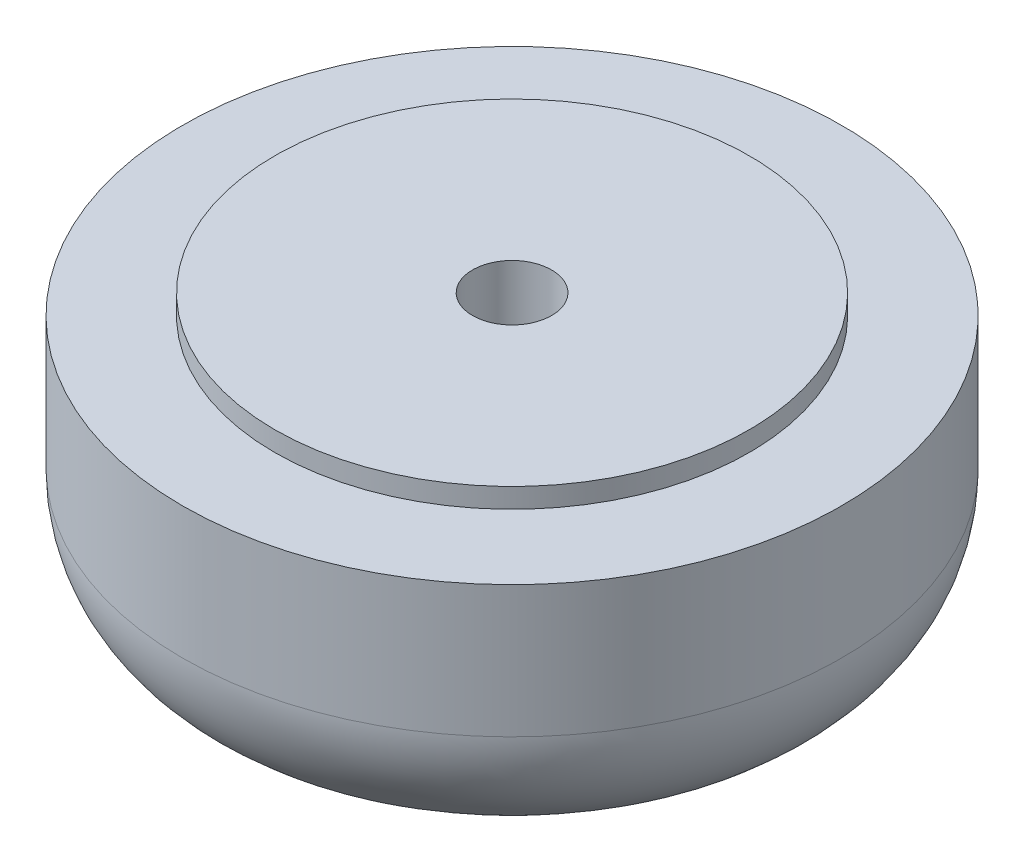
ISO-10303-21;
HEADER;
FILE_DESCRIPTION(('STEP AP214'),'2;1');
FILE_NAME('part.step','',(''),(''),'','','');
FILE_SCHEMA(('AUTOMOTIVE_DESIGN { 1 0 10303 214 1 1 1 1 }'));
ENDSEC;
DATA;
#1=APPLICATION_CONTEXT('core data for automotive mechanical design processes');
#2=APPLICATION_PROTOCOL_DEFINITION('international standard','automotive_design',2000,#1);
#3=PRODUCT_CONTEXT('',#1,'mechanical');
#4=PRODUCT('Part','Part','',(#3));
#5=PRODUCT_RELATED_PRODUCT_CATEGORY('part','',(#4));
#6=PRODUCT_DEFINITION_FORMATION('','',#4);
#7=PRODUCT_DEFINITION_CONTEXT('part definition',#1,'design');
#8=PRODUCT_DEFINITION('design','',#6,#7);
#9=PRODUCT_DEFINITION_SHAPE('','',#8);
#10=(LENGTH_UNIT() NAMED_UNIT(*) SI_UNIT(.MILLI.,.METRE.));
#11=(NAMED_UNIT(*) PLANE_ANGLE_UNIT() SI_UNIT($,.RADIAN.));
#12=(NAMED_UNIT(*) SI_UNIT($,.STERADIAN.) SOLID_ANGLE_UNIT());
#13=UNCERTAINTY_MEASURE_WITH_UNIT(LENGTH_MEASURE(1.E-05),#10,'distance_accuracy_value','');
#14=(GEOMETRIC_REPRESENTATION_CONTEXT(3) GLOBAL_UNCERTAINTY_ASSIGNED_CONTEXT((#13)) GLOBAL_UNIT_ASSIGNED_CONTEXT((#10,
#11,#12)) REPRESENTATION_CONTEXT('',''));
#15=CARTESIAN_POINT('',(0.,0.,0.));
#16=DIRECTION('',(0.,0.,1.));
#17=DIRECTION('',(1.,0.,0.));
#18=AXIS2_PLACEMENT_3D('',#15,#16,#17);
#19=CARTESIAN_POINT('',(0.,4.,0.));
#20=DIRECTION('',(0.,-1.,0.));
#21=DIRECTION('',(0.,0.,-1.));
#22=AXIS2_PLACEMENT_3D('',#19,#20,#21);
#23=CYLINDRICAL_SURFACE('',#22,5.);
#24=CARTESIAN_POINT('',(0.,2.,0.));
#25=DIRECTION('',(0.,1.,0.));
#26=DIRECTION('',(0.,0.,1.));
#27=AXIS2_PLACEMENT_3D('',#24,#25,#26);
#28=CIRCLE('',#27,5.);
#29=CARTESIAN_POINT('',(0.,2.,5.));
#30=VERTEX_POINT('',#29);
#31=EDGE_CURVE('E40',#30,#30,#28,.T.);
#32=ORIENTED_EDGE('',*,*,#31,.T.);
#33=EDGE_LOOP('',(#32));
#34=FACE_BOUND('',#33,.T.);
#35=CARTESIAN_POINT('',(0.,4.,0.));
#36=DIRECTION('',(0.,1.,0.));
#37=DIRECTION('',(0.,0.,1.));
#38=AXIS2_PLACEMENT_3D('',#35,#36,#37);
#39=CIRCLE('',#38,5.);
#40=CARTESIAN_POINT('',(0.,4.,5.));
#41=VERTEX_POINT('',#40);
#42=EDGE_CURVE('E48',#41,#41,#39,.T.);
#43=ORIENTED_EDGE('',*,*,#42,.F.);
#44=EDGE_LOOP('',(#43));
#45=FACE_BOUND('',#44,.T.);
#46=ADVANCED_FACE('F33',(#34,#45),#23,.T.);
#47=CARTESIAN_POINT('',(0.,4.,0.));
#48=DIRECTION('',(0.,1.,0.));
#49=DIRECTION('',(0.,0.,1.));
#50=AXIS2_PLACEMENT_3D('',#47,#48,#49);
#51=PLANE('',#50);
#52=CARTESIAN_POINT('',(0.,4.,0.));
#53=DIRECTION('',(0.,1.,0.));
#54=DIRECTION('',(0.,0.,1.));
#55=AXIS2_PLACEMENT_3D('',#52,#53,#54);
#56=CIRCLE('',#55,3.6);
#57=CARTESIAN_POINT('',(0.,4.,3.6));
#58=VERTEX_POINT('',#57);
#59=EDGE_CURVE('E44',#58,#58,#56,.T.);
#60=ORIENTED_EDGE('',*,*,#59,.F.);
#61=EDGE_LOOP('',(#60));
#62=FACE_BOUND('',#61,.T.);
#63=ORIENTED_EDGE('',*,*,#42,.T.);
#64=EDGE_LOOP('',(#63));
#65=FACE_BOUND('',#64,.T.);
#66=ADVANCED_FACE('F83',(#62,#65),#51,.T.);
#67=CARTESIAN_POINT('',(0.,0.,0.));
#68=DIRECTION('',(0.,1.,0.));
#69=DIRECTION('',(0.,0.,1.));
#70=AXIS2_PLACEMENT_3D('',#67,#68,#69);
#71=PLANE('',#70);
#72=CARTESIAN_POINT('',(0.,0.,0.));
#73=DIRECTION('',(0.,1.,0.));
#74=DIRECTION('',(0.,0.,1.));
#75=AXIS2_PLACEMENT_3D('',#72,#73,#74);
#76=CIRCLE('',#75,0.6);
#77=CARTESIAN_POINT('',(0.,0.,0.6));
#78=VERTEX_POINT('',#77);
#79=EDGE_CURVE('E56',#78,#78,#76,.T.);
#80=ORIENTED_EDGE('',*,*,#79,.T.);
#81=EDGE_LOOP('',(#80));
#82=FACE_BOUND('',#81,.T.);
#83=CARTESIAN_POINT('',(0.,0.,0.));
#84=DIRECTION('',(0.,1.,0.));
#85=DIRECTION('',(0.,0.,1.));
#86=AXIS2_PLACEMENT_3D('',#83,#84,#85);
#87=CIRCLE('',#86,3.);
#88=CARTESIAN_POINT('',(0.,0.,3.));
#89=VERTEX_POINT('',#88);
#90=EDGE_CURVE('E10',#89,#89,#87,.F.);
#91=ORIENTED_EDGE('',*,*,#90,.T.);
#92=EDGE_LOOP('',(#91));
#93=FACE_BOUND('',#92,.T.);
#94=ADVANCED_FACE('F63',(#82,#93),#71,.F.);
#95=CARTESIAN_POINT('',(0.,4.3,0.));
#96=DIRECTION('',(0.,-1.,0.));
#97=DIRECTION('',(0.,0.,-1.));
#98=AXIS2_PLACEMENT_3D('',#95,#96,#97);
#99=CYLINDRICAL_SURFACE('',#98,3.6);
#100=CARTESIAN_POINT('',(0.,4.3,0.));
#101=DIRECTION('',(0.,1.,0.));
#102=DIRECTION('',(0.,0.,1.));
#103=AXIS2_PLACEMENT_3D('',#100,#101,#102);
#104=CIRCLE('',#103,3.6);
#105=CARTESIAN_POINT('',(0.,4.3,3.6));
#106=VERTEX_POINT('',#105);
#107=EDGE_CURVE('E52',#106,#106,#104,.T.);
#108=ORIENTED_EDGE('',*,*,#107,.F.);
#109=EDGE_LOOP('',(#108));
#110=FACE_BOUND('',#109,.T.);
#111=ORIENTED_EDGE('',*,*,#59,.T.);
#112=EDGE_LOOP('',(#111));
#113=FACE_BOUND('',#112,.T.);
#114=ADVANCED_FACE('F74',(#110,#113),#99,.T.);
#115=CARTESIAN_POINT('',(0.,4.3,0.));
#116=DIRECTION('',(0.,1.,0.));
#117=DIRECTION('',(0.,0.,1.));
#118=AXIS2_PLACEMENT_3D('',#115,#116,#117);
#119=PLANE('',#118);
#120=CARTESIAN_POINT('',(0.,4.3,0.));
#121=DIRECTION('',(0.,1.,0.));
#122=DIRECTION('',(0.,0.,1.));
#123=AXIS2_PLACEMENT_3D('',#120,#121,#122);
#124=CIRCLE('',#123,0.6);
#125=CARTESIAN_POINT('',(0.,4.3,0.6));
#126=VERTEX_POINT('',#125);
#127=EDGE_CURVE('E57',#126,#126,#124,.T.);
#128=ORIENTED_EDGE('',*,*,#127,.F.);
#129=EDGE_LOOP('',(#128));
#130=FACE_BOUND('',#129,.T.);
#131=ORIENTED_EDGE('',*,*,#107,.T.);
#132=EDGE_LOOP('',(#131));
#133=FACE_BOUND('',#132,.T.);
#134=ADVANCED_FACE('F71',(#130,#133),#119,.T.);
#135=CARTESIAN_POINT('',(0.,2.,0.));
#136=DIRECTION('',(0.,1.,0.));
#137=DIRECTION('',(0.,0.,1.));
#138=AXIS2_PLACEMENT_3D('',#135,#136,#137);
#139=TOROIDAL_SURFACE('',#138,3.,2.);
#140=ORIENTED_EDGE('',*,*,#90,.F.);
#141=EDGE_LOOP('',(#140));
#142=FACE_BOUND('',#141,.T.);
#143=ORIENTED_EDGE('',*,*,#31,.F.);
#144=EDGE_LOOP('',(#143));
#145=FACE_BOUND('',#144,.T.);
#146=ADVANCED_FACE('F35',(#142,#145),#139,.T.);
#147=CARTESIAN_POINT('',(0.,0.,0.));
#148=DIRECTION('',(0.,1.,0.));
#149=DIRECTION('',(0.,0.,1.));
#150=AXIS2_PLACEMENT_3D('',#147,#148,#149);
#151=CYLINDRICAL_SURFACE('',#150,0.6);
#152=ORIENTED_EDGE('',*,*,#79,.F.);
#153=EDGE_LOOP('',(#152));
#154=FACE_BOUND('',#153,.T.);
#155=ORIENTED_EDGE('',*,*,#127,.T.);
#156=EDGE_LOOP('',(#155));
#157=FACE_BOUND('',#156,.T.);
#158=ADVANCED_FACE('F65',(#154,#157),#151,.F.);
#159=CLOSED_SHELL('',(#46,#66,#94,#114,#134,#146,#158));
#160=MANIFOLD_SOLID_BREP('B2',#159);
#161=ADVANCED_BREP_SHAPE_REPRESENTATION('',(#18,#160),#14);
#162=SHAPE_DEFINITION_REPRESENTATION(#9,#161);
ENDSEC;
END-ISO-10303-21;
